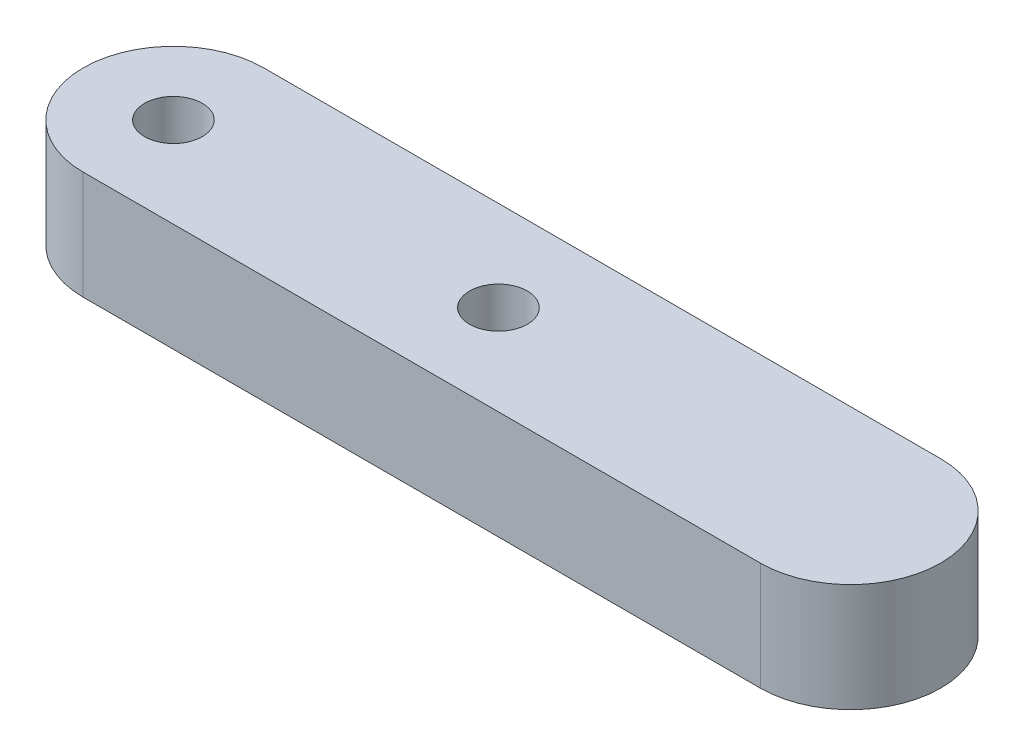
ISO-10303-21;
HEADER;
FILE_DESCRIPTION(('STEP AP214'),'2;1');
FILE_NAME('part.step','',(''),(''),'','','');
FILE_SCHEMA(('AUTOMOTIVE_DESIGN { 1 0 10303 214 1 1 1 1 }'));
ENDSEC;
DATA;
#1=APPLICATION_CONTEXT('core data for automotive mechanical design processes');
#2=APPLICATION_PROTOCOL_DEFINITION('international standard','automotive_design',2000,#1);
#3=PRODUCT_CONTEXT('',#1,'mechanical');
#4=PRODUCT('Part','Part','',(#3));
#5=PRODUCT_RELATED_PRODUCT_CATEGORY('part','',(#4));
#6=PRODUCT_DEFINITION_FORMATION('','',#4);
#7=PRODUCT_DEFINITION_CONTEXT('part definition',#1,'design');
#8=PRODUCT_DEFINITION('design','',#6,#7);
#9=PRODUCT_DEFINITION_SHAPE('','',#8);
#10=(LENGTH_UNIT() NAMED_UNIT(*) SI_UNIT(.MILLI.,.METRE.));
#11=(NAMED_UNIT(*) PLANE_ANGLE_UNIT() SI_UNIT($,.RADIAN.));
#12=(NAMED_UNIT(*) SI_UNIT($,.STERADIAN.) SOLID_ANGLE_UNIT());
#13=UNCERTAINTY_MEASURE_WITH_UNIT(LENGTH_MEASURE(1.E-05),#10,'distance_accuracy_value','');
#14=(GEOMETRIC_REPRESENTATION_CONTEXT(3) GLOBAL_UNCERTAINTY_ASSIGNED_CONTEXT((#13)) GLOBAL_UNIT_ASSIGNED_CONTEXT((#10,
#11,#12)) REPRESENTATION_CONTEXT('',''));
#15=CARTESIAN_POINT('',(0.,0.,0.));
#16=DIRECTION('',(0.,0.,1.));
#17=DIRECTION('',(1.,0.,0.));
#18=AXIS2_PLACEMENT_3D('',#15,#16,#17);
#19=CARTESIAN_POINT('',(-18.75,6.,0.));
#20=DIRECTION('',(0.,1.,0.));
#21=DIRECTION('',(0.,0.,1.));
#22=AXIS2_PLACEMENT_3D('',#19,#20,#21);
#23=PLANE('',#22);
#24=CARTESIAN_POINT('',(-18.75,6.,0.));
#25=DIRECTION('',(0.,1.,0.));
#26=DIRECTION('',(0.,0.,1.));
#27=AXIS2_PLACEMENT_3D('',#24,#25,#26);
#28=CIRCLE('',#27,1.6);
#29=CARTESIAN_POINT('',(-18.75,6.,1.6));
#30=VERTEX_POINT('',#29);
#31=EDGE_CURVE('E112',#30,#30,#28,.T.);
#32=ORIENTED_EDGE('',*,*,#31,.F.);
#33=EDGE_LOOP('',(#32));
#34=FACE_BOUND('',#33,.T.);
#35=CARTESIAN_POINT('',(-18.75,6.,0.));
#36=DIRECTION('',(0.,1.,0.));
#37=DIRECTION('',(0.,0.,1.));
#38=AXIS2_PLACEMENT_3D('',#35,#36,#37);
#39=CIRCLE('',#38,5.);
#40=CARTESIAN_POINT('',(-18.75,6.,-5.));
#41=VERTEX_POINT('',#40);
#42=CARTESIAN_POINT('',(-18.75,6.,5.));
#43=VERTEX_POINT('',#42);
#44=EDGE_CURVE('E92',#41,#43,#39,.T.);
#45=ORIENTED_EDGE('',*,*,#44,.T.);
#46=DIRECTION('',(1.,0.,0.));
#47=VECTOR('',#46,1.);
#48=CARTESIAN_POINT('',(-18.75,6.,5.));
#49=LINE('',#48,#47);
#50=CARTESIAN_POINT('',(18.75,6.,5.));
#51=VERTEX_POINT('',#50);
#52=EDGE_CURVE('E87',#43,#51,#49,.T.);
#53=ORIENTED_EDGE('',*,*,#52,.T.);
#54=CARTESIAN_POINT('',(18.75,6.,0.));
#55=DIRECTION('',(0.,1.,0.));
#56=DIRECTION('',(0.,0.,1.));
#57=AXIS2_PLACEMENT_3D('',#54,#55,#56);
#58=CIRCLE('',#57,5.);
#59=CARTESIAN_POINT('',(18.75,6.,-5.00000000000001));
#60=VERTEX_POINT('',#59);
#61=EDGE_CURVE('E90',#51,#60,#58,.T.);
#62=ORIENTED_EDGE('',*,*,#61,.T.);
#63=DIRECTION('',(-1.,0.,0.));
#64=VECTOR('',#63,1.);
#65=CARTESIAN_POINT('',(-18.75,6.,-5.));
#66=LINE('',#65,#64);
#67=EDGE_CURVE('E57',#60,#41,#66,.T.);
#68=ORIENTED_EDGE('',*,*,#67,.T.);
#69=EDGE_LOOP('',(#45,#53,#62,#68));
#70=FACE_BOUND('',#69,.T.);
#71=CARTESIAN_POINT('',(-0.750000000000001,6.,0.));
#72=DIRECTION('',(0.,1.,0.));
#73=DIRECTION('',(0.,0.,1.));
#74=AXIS2_PLACEMENT_3D('',#71,#72,#73);
#75=CIRCLE('',#74,1.6);
#76=CARTESIAN_POINT('',(-0.750000000000001,6.,1.6));
#77=VERTEX_POINT('',#76);
#78=EDGE_CURVE('E134',#77,#77,#75,.T.);
#79=ORIENTED_EDGE('',*,*,#78,.F.);
#80=EDGE_LOOP('',(#79));
#81=FACE_BOUND('',#80,.T.);
#82=ADVANCED_FACE('F39',(#34,#70,#81),#23,.T.);
#83=CARTESIAN_POINT('',(-18.75,0.,0.));
#84=DIRECTION('',(0.,1.,0.));
#85=DIRECTION('',(0.,0.,1.));
#86=AXIS2_PLACEMENT_3D('',#83,#84,#85);
#87=PLANE('',#86);
#88=CARTESIAN_POINT('',(-18.75,0.,0.));
#89=DIRECTION('',(0.,1.,0.));
#90=DIRECTION('',(0.,0.,1.));
#91=AXIS2_PLACEMENT_3D('',#88,#89,#90);
#92=CIRCLE('',#91,5.);
#93=CARTESIAN_POINT('',(-18.75,0.,-5.));
#94=VERTEX_POINT('',#93);
#95=CARTESIAN_POINT('',(-18.75,0.,5.));
#96=VERTEX_POINT('',#95);
#97=EDGE_CURVE('E108',#94,#96,#92,.T.);
#98=ORIENTED_EDGE('',*,*,#97,.F.);
#99=DIRECTION('',(-1.,0.,0.));
#100=VECTOR('',#99,1.);
#101=CARTESIAN_POINT('',(-18.75,0.,-5.));
#102=LINE('',#101,#100);
#103=CARTESIAN_POINT('',(18.75,0.,-5.00000000000001));
#104=VERTEX_POINT('',#103);
#105=EDGE_CURVE('E80',#104,#94,#102,.T.);
#106=ORIENTED_EDGE('',*,*,#105,.F.);
#107=CARTESIAN_POINT('',(18.75,0.,0.));
#108=DIRECTION('',(0.,1.,0.));
#109=DIRECTION('',(0.,0.,1.));
#110=AXIS2_PLACEMENT_3D('',#107,#108,#109);
#111=CIRCLE('',#110,5.);
#112=CARTESIAN_POINT('',(18.75,0.,5.));
#113=VERTEX_POINT('',#112);
#114=EDGE_CURVE('E74',#113,#104,#111,.T.);
#115=ORIENTED_EDGE('',*,*,#114,.F.);
#116=DIRECTION('',(1.,0.,0.));
#117=VECTOR('',#116,1.);
#118=CARTESIAN_POINT('',(-18.75,0.,5.));
#119=LINE('',#118,#117);
#120=EDGE_CURVE('E97',#96,#113,#119,.T.);
#121=ORIENTED_EDGE('',*,*,#120,.F.);
#122=EDGE_LOOP('',(#98,#106,#115,#121));
#123=FACE_BOUND('',#122,.T.);
#124=CARTESIAN_POINT('',(-18.75,0.,0.));
#125=DIRECTION('',(0.,1.,0.));
#126=DIRECTION('',(0.,0.,1.));
#127=AXIS2_PLACEMENT_3D('',#124,#125,#126);
#128=CIRCLE('',#127,1.6);
#129=CARTESIAN_POINT('',(-18.75,0.,1.6));
#130=VERTEX_POINT('',#129);
#131=EDGE_CURVE('E130',#130,#130,#128,.T.);
#132=ORIENTED_EDGE('',*,*,#131,.T.);
#133=EDGE_LOOP('',(#132));
#134=FACE_BOUND('',#133,.T.);
#135=CARTESIAN_POINT('',(-0.750000000000001,0.,0.));
#136=DIRECTION('',(0.,1.,0.));
#137=DIRECTION('',(0.,0.,1.));
#138=AXIS2_PLACEMENT_3D('',#135,#136,#137);
#139=CIRCLE('',#138,1.6);
#140=CARTESIAN_POINT('',(-0.750000000000001,0.,1.6));
#141=VERTEX_POINT('',#140);
#142=EDGE_CURVE('E138',#141,#141,#139,.T.);
#143=ORIENTED_EDGE('',*,*,#142,.T.);
#144=EDGE_LOOP('',(#143));
#145=FACE_BOUND('',#144,.T.);
#146=ADVANCED_FACE('F125',(#123,#134,#145),#87,.F.);
#147=CARTESIAN_POINT('',(-18.75,6.,0.));
#148=DIRECTION('',(0.,-1.,0.));
#149=DIRECTION('',(0.,0.,-1.));
#150=AXIS2_PLACEMENT_3D('',#147,#148,#149);
#151=CYLINDRICAL_SURFACE('',#150,5.);
#152=ORIENTED_EDGE('',*,*,#97,.T.);
#153=DIRECTION('',(0.,-1.,0.));
#154=VECTOR('',#153,1.);
#155=CARTESIAN_POINT('',(-18.75,6.,5.));
#156=LINE('',#155,#154);
#157=EDGE_CURVE('E11',#43,#96,#156,.T.);
#158=ORIENTED_EDGE('',*,*,#157,.F.);
#159=ORIENTED_EDGE('',*,*,#44,.F.);
#160=DIRECTION('',(0.,-1.,0.));
#161=VECTOR('',#160,1.);
#162=CARTESIAN_POINT('',(-18.75,6.,-5.));
#163=LINE('',#162,#161);
#164=EDGE_CURVE('E104',#41,#94,#163,.T.);
#165=ORIENTED_EDGE('',*,*,#164,.T.);
#166=EDGE_LOOP('',(#152,#158,#159,#165));
#167=FACE_BOUND('',#166,.T.);
#168=ADVANCED_FACE('F41',(#167),#151,.T.);
#169=CARTESIAN_POINT('',(-18.75,6.,5.));
#170=DIRECTION('',(0.,0.,-1.));
#171=DIRECTION('',(-1.,0.,0.));
#172=AXIS2_PLACEMENT_3D('',#169,#170,#171);
#173=PLANE('',#172);
#174=ORIENTED_EDGE('',*,*,#120,.T.);
#175=DIRECTION('',(0.,-1.,0.));
#176=VECTOR('',#175,1.);
#177=CARTESIAN_POINT('',(18.75,6.,5.));
#178=LINE('',#177,#176);
#179=EDGE_CURVE('E49',#51,#113,#178,.T.);
#180=ORIENTED_EDGE('',*,*,#179,.F.);
#181=ORIENTED_EDGE('',*,*,#52,.F.);
#182=ORIENTED_EDGE('',*,*,#157,.T.);
#183=EDGE_LOOP('',(#174,#180,#181,#182));
#184=FACE_BOUND('',#183,.T.);
#185=ADVANCED_FACE('F96',(#184),#173,.F.);
#186=CARTESIAN_POINT('',(18.75,6.,0.));
#187=DIRECTION('',(0.,-1.,0.));
#188=DIRECTION('',(0.,0.,-1.));
#189=AXIS2_PLACEMENT_3D('',#186,#187,#188);
#190=CYLINDRICAL_SURFACE('',#189,5.);
#191=ORIENTED_EDGE('',*,*,#114,.T.);
#192=DIRECTION('',(0.,-1.,0.));
#193=VECTOR('',#192,1.);
#194=CARTESIAN_POINT('',(18.75,6.,-5.00000000000001));
#195=LINE('',#194,#193);
#196=EDGE_CURVE('E99',#60,#104,#195,.T.);
#197=ORIENTED_EDGE('',*,*,#196,.F.);
#198=ORIENTED_EDGE('',*,*,#61,.F.);
#199=ORIENTED_EDGE('',*,*,#179,.T.);
#200=EDGE_LOOP('',(#191,#197,#198,#199));
#201=FACE_BOUND('',#200,.T.);
#202=ADVANCED_FACE('F100',(#201),#190,.T.);
#203=CARTESIAN_POINT('',(-18.75,6.,-5.));
#204=DIRECTION('',(0.,0.,1.));
#205=DIRECTION('',(1.,0.,0.));
#206=AXIS2_PLACEMENT_3D('',#203,#204,#205);
#207=PLANE('',#206);
#208=ORIENTED_EDGE('',*,*,#105,.T.);
#209=ORIENTED_EDGE('',*,*,#164,.F.);
#210=ORIENTED_EDGE('',*,*,#67,.F.);
#211=ORIENTED_EDGE('',*,*,#196,.T.);
#212=EDGE_LOOP('',(#208,#209,#210,#211));
#213=FACE_BOUND('',#212,.T.);
#214=ADVANCED_FACE('F122',(#213),#207,.F.);
#215=CARTESIAN_POINT('',(-18.75,6.,0.));
#216=DIRECTION('',(0.,-1.,0.));
#217=DIRECTION('',(0.,0.,-1.));
#218=AXIS2_PLACEMENT_3D('',#215,#216,#217);
#219=CYLINDRICAL_SURFACE('',#218,1.6);
#220=ORIENTED_EDGE('',*,*,#31,.T.);
#221=EDGE_LOOP('',(#220));
#222=FACE_BOUND('',#221,.T.);
#223=ORIENTED_EDGE('',*,*,#131,.F.);
#224=EDGE_LOOP('',(#223));
#225=FACE_BOUND('',#224,.T.);
#226=ADVANCED_FACE('F157',(#222,#225),#219,.F.);
#227=CARTESIAN_POINT('',(-0.750000000000001,6.,0.));
#228=DIRECTION('',(0.,-1.,0.));
#229=DIRECTION('',(0.,0.,-1.));
#230=AXIS2_PLACEMENT_3D('',#227,#228,#229);
#231=CYLINDRICAL_SURFACE('',#230,1.6);
#232=ORIENTED_EDGE('',*,*,#78,.T.);
#233=EDGE_LOOP('',(#232));
#234=FACE_BOUND('',#233,.T.);
#235=ORIENTED_EDGE('',*,*,#142,.F.);
#236=EDGE_LOOP('',(#235));
#237=FACE_BOUND('',#236,.T.);
#238=ADVANCED_FACE('F146',(#234,#237),#231,.F.);
#239=CLOSED_SHELL('',(#82,#146,#168,#185,#202,#214,#226,#238));
#240=MANIFOLD_SOLID_BREP('B2',#239);
#241=ADVANCED_BREP_SHAPE_REPRESENTATION('',(#18,#240),#14);
#242=SHAPE_DEFINITION_REPRESENTATION(#9,#241);
ENDSEC;
END-ISO-10303-21;
